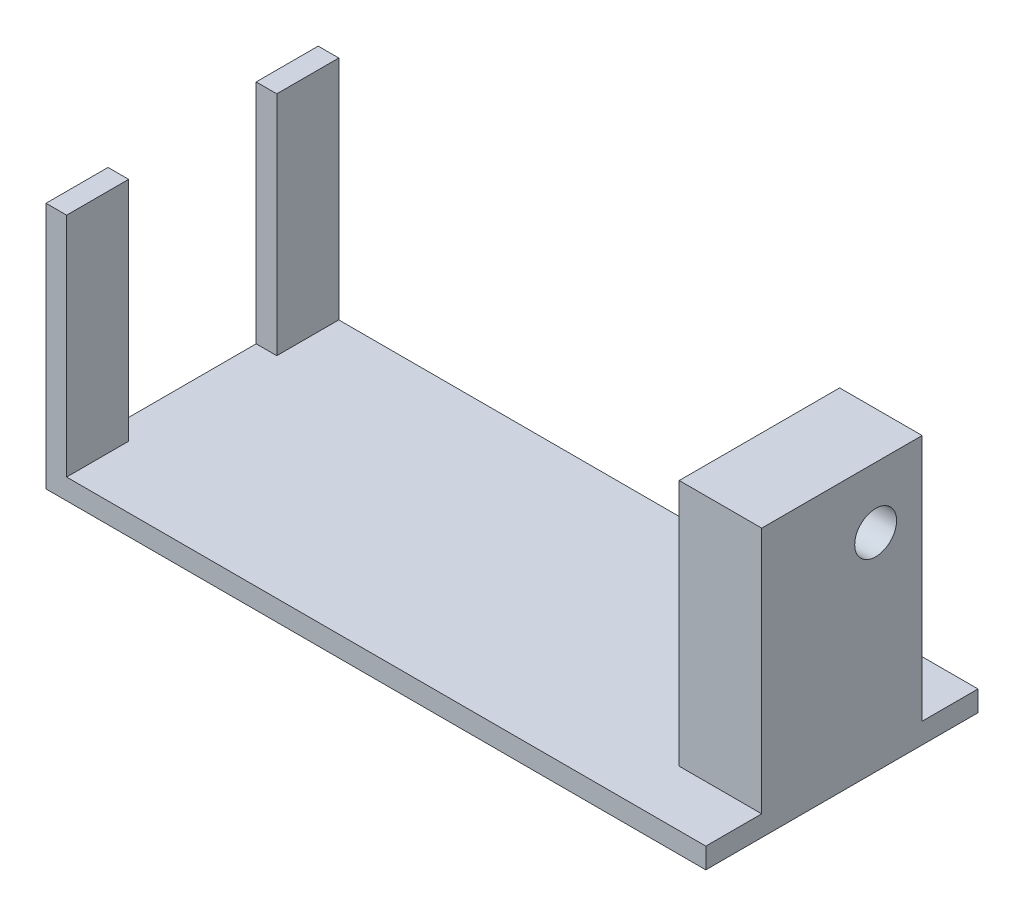
ISO-10303-21;
HEADER;
FILE_DESCRIPTION(('STEP AP214'),'2;1');
FILE_NAME('part.step','',(''),(''),'','','');
FILE_SCHEMA(('AUTOMOTIVE_DESIGN { 1 0 10303 214 1 1 1 1 }'));
ENDSEC;
DATA;
#1=APPLICATION_CONTEXT('core data for automotive mechanical design processes');
#2=APPLICATION_PROTOCOL_DEFINITION('international standard','automotive_design',2000,#1);
#3=PRODUCT_CONTEXT('',#1,'mechanical');
#4=PRODUCT('Part','Part','',(#3));
#5=PRODUCT_RELATED_PRODUCT_CATEGORY('part','',(#4));
#6=PRODUCT_DEFINITION_FORMATION('','',#4);
#7=PRODUCT_DEFINITION_CONTEXT('part definition',#1,'design');
#8=PRODUCT_DEFINITION('design','',#6,#7);
#9=PRODUCT_DEFINITION_SHAPE('','',#8);
#10=(LENGTH_UNIT() NAMED_UNIT(*) SI_UNIT(.MILLI.,.METRE.));
#11=(NAMED_UNIT(*) PLANE_ANGLE_UNIT() SI_UNIT($,.RADIAN.));
#12=(NAMED_UNIT(*) SI_UNIT($,.STERADIAN.) SOLID_ANGLE_UNIT());
#13=UNCERTAINTY_MEASURE_WITH_UNIT(LENGTH_MEASURE(1.E-05),#10,'distance_accuracy_value','');
#14=(GEOMETRIC_REPRESENTATION_CONTEXT(3) GLOBAL_UNCERTAINTY_ASSIGNED_CONTEXT((#13)) GLOBAL_UNIT_ASSIGNED_CONTEXT((#10,
#11,#12)) REPRESENTATION_CONTEXT('',''));
#15=CARTESIAN_POINT('',(0.,0.,0.));
#16=DIRECTION('',(0.,0.,1.));
#17=DIRECTION('',(1.,0.,0.));
#18=AXIS2_PLACEMENT_3D('',#15,#16,#17);
#19=CARTESIAN_POINT('',(0.,3.175,0.));
#20=DIRECTION('',(0.,1.,0.));
#21=DIRECTION('',(0.,0.,1.));
#22=AXIS2_PLACEMENT_3D('',#19,#20,#21);
#23=PLANE('',#22);
#24=DIRECTION('',(0.,0.,1.));
#25=VECTOR('',#24,1.);
#26=CARTESIAN_POINT('',(88.9,3.175,-33.3053971011584));
#27=LINE('',#26,#25);
#28=CARTESIAN_POINT('',(88.9,3.175,-33.3053971011584));
#29=VERTEX_POINT('',#28);
#30=CARTESIAN_POINT('',(88.9,3.175,-8.60460289884159));
#31=VERTEX_POINT('',#30);
#32=EDGE_CURVE('E283',#29,#31,#27,.T.);
#33=ORIENTED_EDGE('',*,*,#32,.F.);
#34=DIRECTION('',(-1.,0.,0.));
#35=VECTOR('',#34,1.);
#36=CARTESIAN_POINT('',(88.9,3.175,-33.3053971011584));
#37=LINE('',#36,#35);
#38=CARTESIAN_POINT('',(101.6,3.175,-33.3053971011584));
#39=VERTEX_POINT('',#38);
#40=EDGE_CURVE('E285',#39,#29,#37,.T.);
#41=ORIENTED_EDGE('',*,*,#40,.F.);
#42=DIRECTION('',(0.,0.,-1.));
#43=VECTOR('',#42,1.);
#44=CARTESIAN_POINT('',(101.6,3.175,0.));
#45=LINE('',#44,#43);
#46=CARTESIAN_POINT('',(101.6,3.175,-41.91));
#47=VERTEX_POINT('',#46);
#48=EDGE_CURVE('E166',#39,#47,#45,.T.);
#49=ORIENTED_EDGE('',*,*,#48,.T.);
#50=DIRECTION('',(1.,0.,0.));
#51=VECTOR('',#50,1.);
#52=CARTESIAN_POINT('',(0.,3.175,-41.91));
#53=LINE('',#52,#51);
#54=CARTESIAN_POINT('',(3.175,3.175,-41.91));
#55=VERTEX_POINT('',#54);
#56=EDGE_CURVE('E170',#55,#47,#53,.T.);
#57=ORIENTED_EDGE('',*,*,#56,.F.);
#58=DIRECTION('',(0.,0.,1.));
#59=VECTOR('',#58,1.);
#60=CARTESIAN_POINT('',(3.175,3.175,0.));
#61=LINE('',#60,#59);
#62=CARTESIAN_POINT('',(3.175,3.17500000000001,-32.3596));
#63=VERTEX_POINT('',#62);
#64=EDGE_CURVE('E173',#55,#63,#61,.T.);
#65=ORIENTED_EDGE('',*,*,#64,.T.);
#66=DIRECTION('',(1.,0.,0.));
#67=VECTOR('',#66,1.);
#68=CARTESIAN_POINT('',(0.,3.175,-32.3596));
#69=LINE('',#68,#67);
#70=CARTESIAN_POINT('',(0.,3.175,-32.3596));
#71=VERTEX_POINT('',#70);
#72=EDGE_CURVE('E139',#71,#63,#69,.T.);
#73=ORIENTED_EDGE('',*,*,#72,.F.);
#74=DIRECTION('',(0.,0.,-1.));
#75=VECTOR('',#74,1.);
#76=CARTESIAN_POINT('',(0.,3.175,0.));
#77=LINE('',#76,#75);
#78=CARTESIAN_POINT('',(0.,3.175,-9.5504));
#79=VERTEX_POINT('',#78);
#80=EDGE_CURVE('E131',#79,#71,#77,.T.);
#81=ORIENTED_EDGE('',*,*,#80,.F.);
#82=DIRECTION('',(1.,0.,0.));
#83=VECTOR('',#82,1.);
#84=CARTESIAN_POINT('',(0.,3.175,-9.5504));
#85=LINE('',#84,#83);
#86=CARTESIAN_POINT('',(3.175,3.175,-9.5504));
#87=VERTEX_POINT('',#86);
#88=EDGE_CURVE('E83',#79,#87,#85,.T.);
#89=ORIENTED_EDGE('',*,*,#88,.T.);
#90=DIRECTION('',(0.,0.,-1.));
#91=VECTOR('',#90,1.);
#92=CARTESIAN_POINT('',(3.175,3.175,0.));
#93=LINE('',#92,#91);
#94=CARTESIAN_POINT('',(3.175,3.175,0.));
#95=VERTEX_POINT('',#94);
#96=EDGE_CURVE('E111',#95,#87,#93,.T.);
#97=ORIENTED_EDGE('',*,*,#96,.F.);
#98=DIRECTION('',(1.,0.,0.));
#99=VECTOR('',#98,1.);
#100=CARTESIAN_POINT('',(0.,3.175,0.));
#101=LINE('',#100,#99);
#102=CARTESIAN_POINT('',(101.6,3.175,0.));
#103=VERTEX_POINT('',#102);
#104=EDGE_CURVE('E162',#95,#103,#101,.T.);
#105=ORIENTED_EDGE('',*,*,#104,.T.);
#106=CARTESIAN_POINT('',(101.6,3.175,-8.60460289884159));
#107=VERTEX_POINT('',#106);
#108=EDGE_CURVE('E167',#103,#107,#45,.T.);
#109=ORIENTED_EDGE('',*,*,#108,.T.);
#110=DIRECTION('',(1.,0.,0.));
#111=VECTOR('',#110,1.);
#112=CARTESIAN_POINT('',(88.9,3.175,-8.60460289884159));
#113=LINE('',#112,#111);
#114=EDGE_CURVE('E275',#31,#107,#113,.T.);
#115=ORIENTED_EDGE('',*,*,#114,.F.);
#116=EDGE_LOOP('',(#33,#41,#49,#57,#65,#73,#81,#89,#97,#105,#109,#115));
#117=FACE_BOUND('',#116,.T.);
#118=ADVANCED_FACE('F38',(#117),#23,.T.);
#119=CARTESIAN_POINT('',(0.,38.1,0.));
#120=DIRECTION('',(0.,0.,-1.));
#121=DIRECTION('',(-1.,0.,0.));
#122=AXIS2_PLACEMENT_3D('',#119,#120,#121);
#123=PLANE('',#122);
#124=DIRECTION('',(1.,0.,0.));
#125=VECTOR('',#124,1.);
#126=CARTESIAN_POINT('',(0.,0.,0.));
#127=LINE('',#126,#125);
#128=CARTESIAN_POINT('',(0.,0.,0.));
#129=VERTEX_POINT('',#128);
#130=CARTESIAN_POINT('',(101.6,0.,0.));
#131=VERTEX_POINT('',#130);
#132=EDGE_CURVE('E121',#129,#131,#127,.T.);
#133=ORIENTED_EDGE('',*,*,#132,.T.);
#134=DIRECTION('',(0.,-1.,0.));
#135=VECTOR('',#134,1.);
#136=CARTESIAN_POINT('',(101.6,3.175,0.));
#137=LINE('',#136,#135);
#138=EDGE_CURVE('E124',#103,#131,#137,.T.);
#139=ORIENTED_EDGE('',*,*,#138,.F.);
#140=ORIENTED_EDGE('',*,*,#104,.F.);
#141=DIRECTION('',(0.,-1.,0.));
#142=VECTOR('',#141,1.);
#143=CARTESIAN_POINT('',(3.175,38.1,0.));
#144=LINE('',#143,#142);
#145=CARTESIAN_POINT('',(3.175,38.1,0.));
#146=VERTEX_POINT('',#145);
#147=EDGE_CURVE('E11',#146,#95,#144,.T.);
#148=ORIENTED_EDGE('',*,*,#147,.F.);
#149=DIRECTION('',(1.,0.,0.));
#150=VECTOR('',#149,1.);
#151=CARTESIAN_POINT('',(0.,38.1,0.));
#152=LINE('',#151,#150);
#153=CARTESIAN_POINT('',(0.,38.1,0.));
#154=VERTEX_POINT('',#153);
#155=EDGE_CURVE('E105',#154,#146,#152,.T.);
#156=ORIENTED_EDGE('',*,*,#155,.F.);
#157=DIRECTION('',(0.,-1.,0.));
#158=VECTOR('',#157,1.);
#159=CARTESIAN_POINT('',(0.,38.1,0.));
#160=LINE('',#159,#158);
#161=EDGE_CURVE('E62',#154,#129,#160,.T.);
#162=ORIENTED_EDGE('',*,*,#161,.T.);
#163=EDGE_LOOP('',(#133,#139,#140,#148,#156,#162));
#164=FACE_BOUND('',#163,.T.);
#165=ADVANCED_FACE('F40',(#164),#123,.F.);
#166=CARTESIAN_POINT('',(3.175,38.1,0.));
#167=DIRECTION('',(-1.,0.,0.));
#168=DIRECTION('',(0.,0.,1.));
#169=AXIS2_PLACEMENT_3D('',#166,#167,#168);
#170=PLANE('',#169);
#171=ORIENTED_EDGE('',*,*,#147,.T.);
#172=ORIENTED_EDGE('',*,*,#96,.T.);
#173=DIRECTION('',(0.,-1.,0.));
#174=VECTOR('',#173,1.);
#175=CARTESIAN_POINT('',(3.175,38.1,-9.5504));
#176=LINE('',#175,#174);
#177=CARTESIAN_POINT('',(3.175,38.1,-9.5504));
#178=VERTEX_POINT('',#177);
#179=EDGE_CURVE('E46',#178,#87,#176,.T.);
#180=ORIENTED_EDGE('',*,*,#179,.F.);
#181=DIRECTION('',(0.,0.,-1.));
#182=VECTOR('',#181,1.);
#183=CARTESIAN_POINT('',(3.175,38.1,0.));
#184=LINE('',#183,#182);
#185=EDGE_CURVE('E99',#146,#178,#184,.T.);
#186=ORIENTED_EDGE('',*,*,#185,.F.);
#187=EDGE_LOOP('',(#171,#172,#180,#186));
#188=FACE_BOUND('',#187,.T.);
#189=ADVANCED_FACE('F110',(#188),#170,.F.);
#190=CARTESIAN_POINT('',(0.,38.1,-9.5504));
#191=DIRECTION('',(0.,0.,-1.));
#192=DIRECTION('',(-1.,0.,0.));
#193=AXIS2_PLACEMENT_3D('',#190,#191,#192);
#194=PLANE('',#193);
#195=ORIENTED_EDGE('',*,*,#88,.F.);
#196=DIRECTION('',(0.,-1.,0.));
#197=VECTOR('',#196,1.);
#198=CARTESIAN_POINT('',(0.,38.1,-9.5504));
#199=LINE('',#198,#197);
#200=CARTESIAN_POINT('',(0.,38.1,-9.5504));
#201=VERTEX_POINT('',#200);
#202=EDGE_CURVE('E113',#201,#79,#199,.T.);
#203=ORIENTED_EDGE('',*,*,#202,.F.);
#204=DIRECTION('',(1.,0.,0.));
#205=VECTOR('',#204,1.);
#206=CARTESIAN_POINT('',(0.,38.1,-9.5504));
#207=LINE('',#206,#205);
#208=EDGE_CURVE('E104',#201,#178,#207,.T.);
#209=ORIENTED_EDGE('',*,*,#208,.T.);
#210=ORIENTED_EDGE('',*,*,#179,.T.);
#211=EDGE_LOOP('',(#195,#203,#209,#210));
#212=FACE_BOUND('',#211,.T.);
#213=ADVANCED_FACE('F114',(#212),#194,.T.);
#214=CARTESIAN_POINT('',(0.,38.1,0.));
#215=DIRECTION('',(-1.,0.,0.));
#216=DIRECTION('',(0.,0.,1.));
#217=AXIS2_PLACEMENT_3D('',#214,#215,#216);
#218=PLANE('',#217);
#219=DIRECTION('',(0.,0.,-1.));
#220=VECTOR('',#219,1.);
#221=CARTESIAN_POINT('',(0.,0.,0.));
#222=LINE('',#221,#220);
#223=CARTESIAN_POINT('',(0.,0.,-41.91));
#224=VERTEX_POINT('',#223);
#225=EDGE_CURVE('E123',#129,#224,#222,.T.);
#226=ORIENTED_EDGE('',*,*,#225,.F.);
#227=ORIENTED_EDGE('',*,*,#161,.F.);
#228=DIRECTION('',(0.,0.,-1.));
#229=VECTOR('',#228,1.);
#230=CARTESIAN_POINT('',(0.,38.1,0.));
#231=LINE('',#230,#229);
#232=EDGE_CURVE('E116',#154,#201,#231,.T.);
#233=ORIENTED_EDGE('',*,*,#232,.T.);
#234=ORIENTED_EDGE('',*,*,#202,.T.);
#235=ORIENTED_EDGE('',*,*,#80,.T.);
#236=DIRECTION('',(0.,-1.,0.));
#237=VECTOR('',#236,1.);
#238=CARTESIAN_POINT('',(0.,38.1,-32.3596));
#239=LINE('',#238,#237);
#240=CARTESIAN_POINT('',(0.,38.1,-32.3596));
#241=VERTEX_POINT('',#240);
#242=EDGE_CURVE('E135',#241,#71,#239,.T.);
#243=ORIENTED_EDGE('',*,*,#242,.F.);
#244=DIRECTION('',(0.,0.,-1.));
#245=VECTOR('',#244,1.);
#246=CARTESIAN_POINT('',(0.,38.1,0.));
#247=LINE('',#246,#245);
#248=CARTESIAN_POINT('',(0.,38.1,-41.91));
#249=VERTEX_POINT('',#248);
#250=EDGE_CURVE('E233',#241,#249,#247,.T.);
#251=ORIENTED_EDGE('',*,*,#250,.T.);
#252=DIRECTION('',(0.,-1.,0.));
#253=VECTOR('',#252,1.);
#254=CARTESIAN_POINT('',(0.,38.1,-41.91));
#255=LINE('',#254,#253);
#256=EDGE_CURVE('E149',#249,#224,#255,.T.);
#257=ORIENTED_EDGE('',*,*,#256,.T.);
#258=EDGE_LOOP('',(#226,#227,#233,#234,#235,#243,#251,#257));
#259=FACE_BOUND('',#258,.T.);
#260=ADVANCED_FACE('F129',(#259),#218,.T.);
#261=CARTESIAN_POINT('',(0.,38.1,0.));
#262=DIRECTION('',(0.,1.,0.));
#263=DIRECTION('',(0.,0.,1.));
#264=AXIS2_PLACEMENT_3D('',#261,#262,#263);
#265=PLANE('',#264);
#266=ORIENTED_EDGE('',*,*,#155,.T.);
#267=ORIENTED_EDGE('',*,*,#185,.T.);
#268=ORIENTED_EDGE('',*,*,#208,.F.);
#269=ORIENTED_EDGE('',*,*,#232,.F.);
#270=EDGE_LOOP('',(#266,#267,#268,#269));
#271=FACE_BOUND('',#270,.T.);
#272=ADVANCED_FACE('F101',(#271),#265,.T.);
#273=CARTESIAN_POINT('',(0.,0.,0.));
#274=DIRECTION('',(0.,1.,0.));
#275=DIRECTION('',(0.,0.,1.));
#276=AXIS2_PLACEMENT_3D('',#273,#274,#275);
#277=PLANE('',#276);
#278=ORIENTED_EDGE('',*,*,#132,.F.);
#279=ORIENTED_EDGE('',*,*,#225,.T.);
#280=DIRECTION('',(1.,0.,0.));
#281=VECTOR('',#280,1.);
#282=CARTESIAN_POINT('',(0.,0.,-41.91));
#283=LINE('',#282,#281);
#284=CARTESIAN_POINT('',(101.6,0.,-41.91));
#285=VERTEX_POINT('',#284);
#286=EDGE_CURVE('E163',#224,#285,#283,.T.);
#287=ORIENTED_EDGE('',*,*,#286,.T.);
#288=DIRECTION('',(0.,0.,-1.));
#289=VECTOR('',#288,1.);
#290=CARTESIAN_POINT('',(101.6,0.,0.));
#291=LINE('',#290,#289);
#292=EDGE_CURVE('E160',#131,#285,#291,.T.);
#293=ORIENTED_EDGE('',*,*,#292,.F.);
#294=EDGE_LOOP('',(#278,#279,#287,#293));
#295=FACE_BOUND('',#294,.T.);
#296=ADVANCED_FACE('F195',(#295),#277,.F.);
#297=CARTESIAN_POINT('',(101.6,3.175,0.));
#298=DIRECTION('',(-1.,0.,0.));
#299=DIRECTION('',(0.,0.,1.));
#300=AXIS2_PLACEMENT_3D('',#297,#298,#299);
#301=PLANE('',#300);
#302=CARTESIAN_POINT('',(101.6,31.9024,-26.1502171011584));
#303=DIRECTION('',(-1.,0.,0.));
#304=DIRECTION('',(0.,0.,1.));
#305=AXIS2_PLACEMENT_3D('',#302,#303,#304);
#306=CIRCLE('',#305,3.2258);
#307=CARTESIAN_POINT('',(101.6,31.9024,-22.9244171011584));
#308=VERTEX_POINT('',#307);
#309=EDGE_CURVE('E287',#308,#308,#306,.T.);
#310=ORIENTED_EDGE('',*,*,#309,.T.);
#311=EDGE_LOOP('',(#310));
#312=FACE_BOUND('',#311,.T.);
#313=ORIENTED_EDGE('',*,*,#292,.T.);
#314=DIRECTION('',(0.,-1.,0.));
#315=VECTOR('',#314,1.);
#316=CARTESIAN_POINT('',(101.6,3.175,-41.91));
#317=LINE('',#316,#315);
#318=EDGE_CURVE('E178',#47,#285,#317,.T.);
#319=ORIENTED_EDGE('',*,*,#318,.F.);
#320=ORIENTED_EDGE('',*,*,#48,.F.);
#321=DIRECTION('',(0.,-1.,0.));
#322=VECTOR('',#321,1.);
#323=CARTESIAN_POINT('',(101.6,41.275,-33.3053971011584));
#324=LINE('',#323,#322);
#325=CARTESIAN_POINT('',(101.6,41.275,-33.3053971011584));
#326=VERTEX_POINT('',#325);
#327=EDGE_CURVE('E237',#326,#39,#324,.T.);
#328=ORIENTED_EDGE('',*,*,#327,.F.);
#329=DIRECTION('',(0.,0.,-1.));
#330=VECTOR('',#329,1.);
#331=CARTESIAN_POINT('',(101.6,41.275,-33.3053971011584));
#332=LINE('',#331,#330);
#333=CARTESIAN_POINT('',(101.6,41.275,-8.60460289884159));
#334=VERTEX_POINT('',#333);
#335=EDGE_CURVE('E269',#334,#326,#332,.T.);
#336=ORIENTED_EDGE('',*,*,#335,.F.);
#337=DIRECTION('',(0.,-1.,0.));
#338=VECTOR('',#337,1.);
#339=CARTESIAN_POINT('',(101.6,41.275,-8.60460289884159));
#340=LINE('',#339,#338);
#341=EDGE_CURVE('E280',#334,#107,#340,.T.);
#342=ORIENTED_EDGE('',*,*,#341,.T.);
#343=ORIENTED_EDGE('',*,*,#108,.F.);
#344=ORIENTED_EDGE('',*,*,#138,.T.);
#345=EDGE_LOOP('',(#313,#319,#320,#328,#336,#342,#343,#344));
#346=FACE_BOUND('',#345,.T.);
#347=ADVANCED_FACE('F189',(#312,#346),#301,.F.);
#348=CARTESIAN_POINT('',(0.,3.175,-41.91));
#349=DIRECTION('',(0.,0.,-1.));
#350=DIRECTION('',(-1.,0.,0.));
#351=AXIS2_PLACEMENT_3D('',#348,#349,#350);
#352=PLANE('',#351);
#353=ORIENTED_EDGE('',*,*,#286,.F.);
#354=ORIENTED_EDGE('',*,*,#256,.F.);
#355=DIRECTION('',(1.,0.,0.));
#356=VECTOR('',#355,1.);
#357=CARTESIAN_POINT('',(0.,38.1,-41.91));
#358=LINE('',#357,#356);
#359=CARTESIAN_POINT('',(3.175,38.1,-41.91));
#360=VERTEX_POINT('',#359);
#361=EDGE_CURVE('E231',#249,#360,#358,.T.);
#362=ORIENTED_EDGE('',*,*,#361,.T.);
#363=DIRECTION('',(0.,-1.,0.));
#364=VECTOR('',#363,1.);
#365=CARTESIAN_POINT('',(3.175,38.1,-41.91));
#366=LINE('',#365,#364);
#367=EDGE_CURVE('E153',#360,#55,#366,.T.);
#368=ORIENTED_EDGE('',*,*,#367,.T.);
#369=ORIENTED_EDGE('',*,*,#56,.T.);
#370=ORIENTED_EDGE('',*,*,#318,.T.);
#371=EDGE_LOOP('',(#353,#354,#362,#368,#369,#370));
#372=FACE_BOUND('',#371,.T.);
#373=ADVANCED_FACE('F200',(#372),#352,.T.);
#374=CARTESIAN_POINT('',(3.175,38.1,0.));
#375=DIRECTION('',(1.,0.,0.));
#376=DIRECTION('',(0.,0.,-1.));
#377=AXIS2_PLACEMENT_3D('',#374,#375,#376);
#378=PLANE('',#377);
#379=DIRECTION('',(0.,-1.,0.));
#380=VECTOR('',#379,1.);
#381=CARTESIAN_POINT('',(3.175,38.1,-32.3596));
#382=LINE('',#381,#380);
#383=CARTESIAN_POINT('',(3.175,38.1,-32.3596));
#384=VERTEX_POINT('',#383);
#385=EDGE_CURVE('E150',#384,#63,#382,.T.);
#386=ORIENTED_EDGE('',*,*,#385,.T.);
#387=ORIENTED_EDGE('',*,*,#64,.F.);
#388=ORIENTED_EDGE('',*,*,#367,.F.);
#389=DIRECTION('',(0.,0.,1.));
#390=VECTOR('',#389,1.);
#391=CARTESIAN_POINT('',(3.175,38.1,0.));
#392=LINE('',#391,#390);
#393=EDGE_CURVE('E234',#360,#384,#392,.T.);
#394=ORIENTED_EDGE('',*,*,#393,.T.);
#395=EDGE_LOOP('',(#386,#387,#388,#394));
#396=FACE_BOUND('',#395,.T.);
#397=ADVANCED_FACE('F228',(#396),#378,.T.);
#398=CARTESIAN_POINT('',(0.,38.1,-32.3596));
#399=DIRECTION('',(0.,0.,-1.));
#400=DIRECTION('',(-1.,0.,0.));
#401=AXIS2_PLACEMENT_3D('',#398,#399,#400);
#402=PLANE('',#401);
#403=ORIENTED_EDGE('',*,*,#72,.T.);
#404=ORIENTED_EDGE('',*,*,#385,.F.);
#405=DIRECTION('',(1.,0.,0.));
#406=VECTOR('',#405,1.);
#407=CARTESIAN_POINT('',(0.,38.1,-32.3596));
#408=LINE('',#407,#406);
#409=EDGE_CURVE('E147',#241,#384,#408,.T.);
#410=ORIENTED_EDGE('',*,*,#409,.F.);
#411=ORIENTED_EDGE('',*,*,#242,.T.);
#412=EDGE_LOOP('',(#403,#404,#410,#411));
#413=FACE_BOUND('',#412,.T.);
#414=ADVANCED_FACE('F143',(#413),#402,.F.);
#415=CARTESIAN_POINT('',(0.,38.1,0.));
#416=DIRECTION('',(0.,1.,0.));
#417=DIRECTION('',(0.,0.,1.));
#418=AXIS2_PLACEMENT_3D('',#415,#416,#417);
#419=PLANE('',#418);
#420=ORIENTED_EDGE('',*,*,#393,.F.);
#421=ORIENTED_EDGE('',*,*,#361,.F.);
#422=ORIENTED_EDGE('',*,*,#250,.F.);
#423=ORIENTED_EDGE('',*,*,#409,.T.);
#424=EDGE_LOOP('',(#420,#421,#422,#423));
#425=FACE_BOUND('',#424,.T.);
#426=ADVANCED_FACE('F240',(#425),#419,.T.);
#427=CARTESIAN_POINT('',(88.9,41.275,-33.3053971011584));
#428=DIRECTION('',(0.,0.,1.));
#429=DIRECTION('',(1.,0.,0.));
#430=AXIS2_PLACEMENT_3D('',#427,#428,#429);
#431=PLANE('',#430);
#432=ORIENTED_EDGE('',*,*,#40,.T.);
#433=DIRECTION('',(0.,-1.,0.));
#434=VECTOR('',#433,1.);
#435=CARTESIAN_POINT('',(88.9,41.275,-33.3053971011584));
#436=LINE('',#435,#434);
#437=CARTESIAN_POINT('',(88.9,41.275,-33.3053971011584));
#438=VERTEX_POINT('',#437);
#439=EDGE_CURVE('E265',#438,#29,#436,.T.);
#440=ORIENTED_EDGE('',*,*,#439,.F.);
#441=DIRECTION('',(-1.,0.,0.));
#442=VECTOR('',#441,1.);
#443=CARTESIAN_POINT('',(88.9,41.275,-33.3053971011584));
#444=LINE('',#443,#442);
#445=EDGE_CURVE('E260',#326,#438,#444,.T.);
#446=ORIENTED_EDGE('',*,*,#445,.F.);
#447=ORIENTED_EDGE('',*,*,#327,.T.);
#448=EDGE_LOOP('',(#432,#440,#446,#447));
#449=FACE_BOUND('',#448,.T.);
#450=ADVANCED_FACE('F262',(#449),#431,.F.);
#451=CARTESIAN_POINT('',(88.9,41.275,-33.3053971011584));
#452=DIRECTION('',(1.,0.,0.));
#453=DIRECTION('',(0.,0.,-1.));
#454=AXIS2_PLACEMENT_3D('',#451,#452,#453);
#455=PLANE('',#454);
#456=CARTESIAN_POINT('',(88.9,31.9024,-26.1502171011584));
#457=DIRECTION('',(-1.,0.,0.));
#458=DIRECTION('',(0.,0.,1.));
#459=AXIS2_PLACEMENT_3D('',#456,#457,#458);
#460=CIRCLE('',#459,3.2258);
#461=CARTESIAN_POINT('',(88.9,31.9024,-22.9244171011584));
#462=VERTEX_POINT('',#461);
#463=EDGE_CURVE('E292',#462,#462,#460,.T.);
#464=ORIENTED_EDGE('',*,*,#463,.F.);
#465=EDGE_LOOP('',(#464));
#466=FACE_BOUND('',#465,.T.);
#467=ORIENTED_EDGE('',*,*,#32,.T.);
#468=DIRECTION('',(0.,-1.,0.));
#469=VECTOR('',#468,1.);
#470=CARTESIAN_POINT('',(88.9,41.275,-8.60460289884159));
#471=LINE('',#470,#469);
#472=CARTESIAN_POINT('',(88.9,41.275,-8.60460289884159));
#473=VERTEX_POINT('',#472);
#474=EDGE_CURVE('E53',#473,#31,#471,.T.);
#475=ORIENTED_EDGE('',*,*,#474,.F.);
#476=DIRECTION('',(0.,0.,1.));
#477=VECTOR('',#476,1.);
#478=CARTESIAN_POINT('',(88.9,41.275,-33.3053971011584));
#479=LINE('',#478,#477);
#480=EDGE_CURVE('E268',#438,#473,#479,.T.);
#481=ORIENTED_EDGE('',*,*,#480,.F.);
#482=ORIENTED_EDGE('',*,*,#439,.T.);
#483=EDGE_LOOP('',(#467,#475,#481,#482));
#484=FACE_BOUND('',#483,.T.);
#485=ADVANCED_FACE('F299',(#466,#484),#455,.F.);
#486=CARTESIAN_POINT('',(88.9,41.275,-8.60460289884159));
#487=DIRECTION('',(0.,0.,-1.));
#488=DIRECTION('',(-1.,0.,0.));
#489=AXIS2_PLACEMENT_3D('',#486,#487,#488);
#490=PLANE('',#489);
#491=ORIENTED_EDGE('',*,*,#114,.T.);
#492=ORIENTED_EDGE('',*,*,#341,.F.);
#493=DIRECTION('',(1.,0.,0.));
#494=VECTOR('',#493,1.);
#495=CARTESIAN_POINT('',(88.9,41.275,-8.60460289884159));
#496=LINE('',#495,#494);
#497=EDGE_CURVE('E273',#473,#334,#496,.T.);
#498=ORIENTED_EDGE('',*,*,#497,.F.);
#499=ORIENTED_EDGE('',*,*,#474,.T.);
#500=EDGE_LOOP('',(#491,#492,#498,#499));
#501=FACE_BOUND('',#500,.T.);
#502=ADVANCED_FACE('F302',(#501),#490,.F.);
#503=CARTESIAN_POINT('',(0.,41.275,0.));
#504=DIRECTION('',(0.,1.,0.));
#505=DIRECTION('',(0.,0.,1.));
#506=AXIS2_PLACEMENT_3D('',#503,#504,#505);
#507=PLANE('',#506);
#508=ORIENTED_EDGE('',*,*,#335,.T.);
#509=ORIENTED_EDGE('',*,*,#445,.T.);
#510=ORIENTED_EDGE('',*,*,#480,.T.);
#511=ORIENTED_EDGE('',*,*,#497,.T.);
#512=EDGE_LOOP('',(#508,#509,#510,#511));
#513=FACE_BOUND('',#512,.T.);
#514=ADVANCED_FACE('F272',(#513),#507,.T.);
#515=CARTESIAN_POINT('',(119.38,31.9024,-26.1502171011584));
#516=DIRECTION('',(-1.,0.,0.));
#517=DIRECTION('',(0.,0.,1.));
#518=AXIS2_PLACEMENT_3D('',#515,#516,#517);
#519=CYLINDRICAL_SURFACE('',#518,3.2258);
#520=ORIENTED_EDGE('',*,*,#463,.T.);
#521=EDGE_LOOP('',(#520));
#522=FACE_BOUND('',#521,.T.);
#523=ORIENTED_EDGE('',*,*,#309,.F.);
#524=EDGE_LOOP('',(#523));
#525=FACE_BOUND('',#524,.T.);
#526=ADVANCED_FACE('F296',(#522,#525),#519,.F.);
#527=CLOSED_SHELL('',(#118,#165,#189,#213,#260,#272,#296,#347,#373,#397,#414,#426,#450,#485,
#502,#514,#526));
#528=MANIFOLD_SOLID_BREP('B2',#527);
#529=ADVANCED_BREP_SHAPE_REPRESENTATION('',(#18,#528),#14);
#530=SHAPE_DEFINITION_REPRESENTATION(#9,#529);
ENDSEC;
END-ISO-10303-21;
